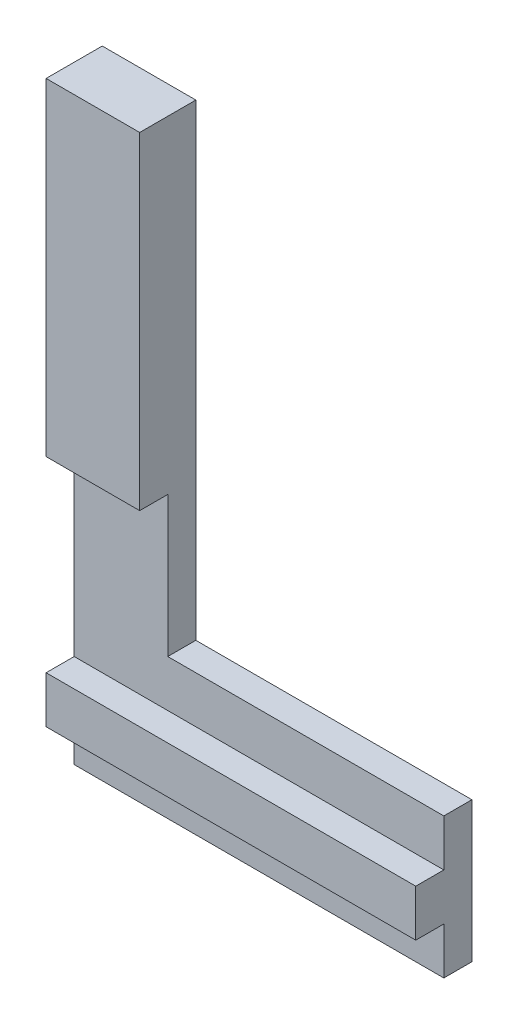
ISO-10303-21;
HEADER;
FILE_DESCRIPTION(('STEP AP214'),'2;1');
FILE_NAME('part.step','',(''),(''),'','','');
FILE_SCHEMA(('AUTOMOTIVE_DESIGN { 1 0 10303 214 1 1 1 1 }'));
ENDSEC;
DATA;
#1=APPLICATION_CONTEXT('core data for automotive mechanical design processes');
#2=APPLICATION_PROTOCOL_DEFINITION('international standard','automotive_design',2000,#1);
#3=PRODUCT_CONTEXT('',#1,'mechanical');
#4=PRODUCT('Part','Part','',(#3));
#5=PRODUCT_RELATED_PRODUCT_CATEGORY('part','',(#4));
#6=PRODUCT_DEFINITION_FORMATION('','',#4);
#7=PRODUCT_DEFINITION_CONTEXT('part definition',#1,'design');
#8=PRODUCT_DEFINITION('design','',#6,#7);
#9=PRODUCT_DEFINITION_SHAPE('','',#8);
#10=(LENGTH_UNIT() NAMED_UNIT(*) SI_UNIT(.MILLI.,.METRE.));
#11=(NAMED_UNIT(*) PLANE_ANGLE_UNIT() SI_UNIT($,.RADIAN.));
#12=(NAMED_UNIT(*) SI_UNIT($,.STERADIAN.) SOLID_ANGLE_UNIT());
#13=UNCERTAINTY_MEASURE_WITH_UNIT(LENGTH_MEASURE(1.E-05),#10,'distance_accuracy_value','');
#14=(GEOMETRIC_REPRESENTATION_CONTEXT(3) GLOBAL_UNCERTAINTY_ASSIGNED_CONTEXT((#13)) GLOBAL_UNIT_ASSIGNED_CONTEXT((#10,
#11,#12)) REPRESENTATION_CONTEXT('',''));
#15=CARTESIAN_POINT('',(0.,0.,0.));
#16=DIRECTION('',(0.,0.,1.));
#17=DIRECTION('',(1.,0.,0.));
#18=AXIS2_PLACEMENT_3D('',#15,#16,#17);
#19=CARTESIAN_POINT('',(0.,0.,6.));
#20=DIRECTION('',(0.,0.,1.));
#21=DIRECTION('',(1.,0.,0.));
#22=AXIS2_PLACEMENT_3D('',#19,#20,#21);
#23=PLANE('',#22);
#24=DIRECTION('',(0.,-1.,0.));
#25=VECTOR('',#24,1.);
#26=CARTESIAN_POINT('',(20.,0.,6.));
#27=LINE('',#26,#25);
#28=CARTESIAN_POINT('',(20.,30.,6.));
#29=VERTEX_POINT('',#28);
#30=CARTESIAN_POINT('',(20.,0.,6.));
#31=VERTEX_POINT('',#30);
#32=EDGE_CURVE('E199',#29,#31,#27,.T.);
#33=ORIENTED_EDGE('',*,*,#32,.F.);
#34=DIRECTION('',(1.,0.,0.));
#35=VECTOR('',#34,1.);
#36=CARTESIAN_POINT('',(0.,30.,6.));
#37=LINE('',#36,#35);
#38=CARTESIAN_POINT('',(0.,30.,6.));
#39=VERTEX_POINT('',#38);
#40=EDGE_CURVE('E141',#39,#29,#37,.T.);
#41=ORIENTED_EDGE('',*,*,#40,.F.);
#42=DIRECTION('',(0.,1.,0.));
#43=VECTOR('',#42,1.);
#44=CARTESIAN_POINT('',(0.,0.,6.));
#45=LINE('',#44,#43);
#46=CARTESIAN_POINT('',(0.,-10.,6.));
#47=VERTEX_POINT('',#46);
#48=EDGE_CURVE('E56',#47,#39,#45,.T.);
#49=ORIENTED_EDGE('',*,*,#48,.F.);
#50=DIRECTION('',(-1.,0.,0.));
#51=VECTOR('',#50,1.);
#52=CARTESIAN_POINT('',(0.,-10.,6.));
#53=LINE('',#52,#51);
#54=CARTESIAN_POINT('',(79.,-10.,6.));
#55=VERTEX_POINT('',#54);
#56=EDGE_CURVE('E51',#55,#47,#53,.T.);
#57=ORIENTED_EDGE('',*,*,#56,.F.);
#58=DIRECTION('',(0.,1.,0.));
#59=VECTOR('',#58,1.);
#60=CARTESIAN_POINT('',(79.,0.,6.));
#61=LINE('',#60,#59);
#62=CARTESIAN_POINT('',(79.,0.,6.));
#63=VERTEX_POINT('',#62);
#64=EDGE_CURVE('E177',#55,#63,#61,.T.);
#65=ORIENTED_EDGE('',*,*,#64,.T.);
#66=DIRECTION('',(-1.,0.,0.));
#67=VECTOR('',#66,1.);
#68=CARTESIAN_POINT('',(0.,0.,6.));
#69=LINE('',#68,#67);
#70=EDGE_CURVE('E181',#63,#31,#69,.T.);
#71=ORIENTED_EDGE('',*,*,#70,.T.);
#72=EDGE_LOOP('',(#33,#41,#49,#57,#65,#71));
#73=FACE_BOUND('',#72,.T.);
#74=ADVANCED_FACE('F36',(#73),#23,.T.);
#75=CARTESIAN_POINT('',(20.,0.,6.));
#76=DIRECTION('',(1.,0.,0.));
#77=DIRECTION('',(0.,1.,0.));
#78=AXIS2_PLACEMENT_3D('',#75,#76,#77);
#79=PLANE('',#78);
#80=DIRECTION('',(0.,-1.,0.));
#81=VECTOR('',#80,1.);
#82=CARTESIAN_POINT('',(20.,0.,0.));
#83=LINE('',#82,#81);
#84=CARTESIAN_POINT('',(20.,100.,0.));
#85=VERTEX_POINT('',#84);
#86=CARTESIAN_POINT('',(20.,0.,0.));
#87=VERTEX_POINT('',#86);
#88=EDGE_CURVE('E198',#85,#87,#83,.T.);
#89=ORIENTED_EDGE('',*,*,#88,.F.);
#90=DIRECTION('',(0.,0.,-1.));
#91=VECTOR('',#90,1.);
#92=CARTESIAN_POINT('',(20.,100.,6.));
#93=LINE('',#92,#91);
#94=CARTESIAN_POINT('',(20.,100.,12.));
#95=VERTEX_POINT('',#94);
#96=EDGE_CURVE('E11',#95,#85,#93,.T.);
#97=ORIENTED_EDGE('',*,*,#96,.F.);
#98=DIRECTION('',(0.,1.,0.));
#99=VECTOR('',#98,1.);
#100=CARTESIAN_POINT('',(20.,0.,12.));
#101=LINE('',#100,#99);
#102=CARTESIAN_POINT('',(20.,30.,12.));
#103=VERTEX_POINT('',#102);
#104=EDGE_CURVE('E132',#103,#95,#101,.T.);
#105=ORIENTED_EDGE('',*,*,#104,.F.);
#106=DIRECTION('',(0.,0.,-1.));
#107=VECTOR('',#106,1.);
#108=CARTESIAN_POINT('',(20.,30.,12.));
#109=LINE('',#108,#107);
#110=EDGE_CURVE('E128',#103,#29,#109,.T.);
#111=ORIENTED_EDGE('',*,*,#110,.T.);
#112=ORIENTED_EDGE('',*,*,#32,.T.);
#113=DIRECTION('',(0.,0.,-1.));
#114=VECTOR('',#113,1.);
#115=CARTESIAN_POINT('',(20.,0.,6.));
#116=LINE('',#115,#114);
#117=EDGE_CURVE('E205',#31,#87,#116,.T.);
#118=ORIENTED_EDGE('',*,*,#117,.T.);
#119=EDGE_LOOP('',(#89,#97,#105,#111,#112,#118));
#120=FACE_BOUND('',#119,.T.);
#121=ADVANCED_FACE('F38',(#120),#79,.T.);
#122=CARTESIAN_POINT('',(0.,100.,6.));
#123=DIRECTION('',(0.,1.,0.));
#124=DIRECTION('',(0.,0.,1.));
#125=AXIS2_PLACEMENT_3D('',#122,#123,#124);
#126=PLANE('',#125);
#127=DIRECTION('',(1.,0.,0.));
#128=VECTOR('',#127,1.);
#129=CARTESIAN_POINT('',(0.,100.,0.));
#130=LINE('',#129,#128);
#131=CARTESIAN_POINT('',(0.,100.,0.));
#132=VERTEX_POINT('',#131);
#133=EDGE_CURVE('E208',#132,#85,#130,.T.);
#134=ORIENTED_EDGE('',*,*,#133,.F.);
#135=DIRECTION('',(0.,0.,-1.));
#136=VECTOR('',#135,1.);
#137=CARTESIAN_POINT('',(0.,100.,6.));
#138=LINE('',#137,#136);
#139=CARTESIAN_POINT('',(0.,100.,12.));
#140=VERTEX_POINT('',#139);
#141=EDGE_CURVE('E44',#140,#132,#138,.T.);
#142=ORIENTED_EDGE('',*,*,#141,.F.);
#143=DIRECTION('',(-1.,0.,0.));
#144=VECTOR('',#143,1.);
#145=CARTESIAN_POINT('',(0.,100.,12.));
#146=LINE('',#145,#144);
#147=EDGE_CURVE('E139',#95,#140,#146,.T.);
#148=ORIENTED_EDGE('',*,*,#147,.F.);
#149=ORIENTED_EDGE('',*,*,#96,.T.);
#150=EDGE_LOOP('',(#134,#142,#148,#149));
#151=FACE_BOUND('',#150,.T.);
#152=ADVANCED_FACE('F217',(#151),#126,.T.);
#153=CARTESIAN_POINT('',(0.,0.,6.));
#154=DIRECTION('',(-1.,0.,0.));
#155=DIRECTION('',(0.,0.,1.));
#156=AXIS2_PLACEMENT_3D('',#153,#154,#155);
#157=PLANE('',#156);
#158=DIRECTION('',(0.,1.,0.));
#159=VECTOR('',#158,1.);
#160=CARTESIAN_POINT('',(0.,0.,0.));
#161=LINE('',#160,#159);
#162=CARTESIAN_POINT('',(0.,-30.,0.));
#163=VERTEX_POINT('',#162);
#164=EDGE_CURVE('E201',#163,#132,#161,.T.);
#165=ORIENTED_EDGE('',*,*,#164,.F.);
#166=DIRECTION('',(0.,0.,-1.));
#167=VECTOR('',#166,1.);
#168=CARTESIAN_POINT('',(0.,-30.,6.));
#169=LINE('',#168,#167);
#170=CARTESIAN_POINT('',(0.,-30.,6.));
#171=VERTEX_POINT('',#170);
#172=EDGE_CURVE('E184',#171,#163,#169,.T.);
#173=ORIENTED_EDGE('',*,*,#172,.F.);
#174=CARTESIAN_POINT('',(0.,-20.,6.));
#175=VERTEX_POINT('',#174);
#176=EDGE_CURVE('E202',#171,#175,#45,.T.);
#177=ORIENTED_EDGE('',*,*,#176,.T.);
#178=DIRECTION('',(0.,0.,-1.));
#179=VECTOR('',#178,1.);
#180=CARTESIAN_POINT('',(0.,-20.,12.));
#181=LINE('',#180,#179);
#182=CARTESIAN_POINT('',(0.,-20.,12.));
#183=VERTEX_POINT('',#182);
#184=EDGE_CURVE('E170',#183,#175,#181,.T.);
#185=ORIENTED_EDGE('',*,*,#184,.F.);
#186=DIRECTION('',(0.,-1.,0.));
#187=VECTOR('',#186,1.);
#188=CARTESIAN_POINT('',(0.,-10.,12.));
#189=LINE('',#188,#187);
#190=CARTESIAN_POINT('',(0.,-10.,12.));
#191=VERTEX_POINT('',#190);
#192=EDGE_CURVE('E152',#191,#183,#189,.T.);
#193=ORIENTED_EDGE('',*,*,#192,.F.);
#194=DIRECTION('',(0.,0.,-1.));
#195=VECTOR('',#194,1.);
#196=CARTESIAN_POINT('',(0.,-10.,12.));
#197=LINE('',#196,#195);
#198=EDGE_CURVE('E160',#191,#47,#197,.T.);
#199=ORIENTED_EDGE('',*,*,#198,.T.);
#200=ORIENTED_EDGE('',*,*,#48,.T.);
#201=DIRECTION('',(0.,0.,-1.));
#202=VECTOR('',#201,1.);
#203=CARTESIAN_POINT('',(0.,30.,12.));
#204=LINE('',#203,#202);
#205=CARTESIAN_POINT('',(0.,30.,12.));
#206=VERTEX_POINT('',#205);
#207=EDGE_CURVE('E126',#206,#39,#204,.T.);
#208=ORIENTED_EDGE('',*,*,#207,.F.);
#209=DIRECTION('',(0.,-1.,0.));
#210=VECTOR('',#209,1.);
#211=CARTESIAN_POINT('',(0.,0.,12.));
#212=LINE('',#211,#210);
#213=EDGE_CURVE('E133',#140,#206,#212,.T.);
#214=ORIENTED_EDGE('',*,*,#213,.F.);
#215=ORIENTED_EDGE('',*,*,#141,.T.);
#216=EDGE_LOOP('',(#165,#173,#177,#185,#193,#199,#200,#208,#214,#215));
#217=FACE_BOUND('',#216,.T.);
#218=ADVANCED_FACE('F143',(#217),#157,.T.);
#219=DIRECTION('',(1.,0.,0.));
#220=VECTOR('',#219,1.);
#221=CARTESIAN_POINT('',(0.,-20.,6.));
#222=LINE('',#221,#220);
#223=CARTESIAN_POINT('',(79.,-20.,6.));
#224=VERTEX_POINT('',#223);
#225=EDGE_CURVE('E145',#175,#224,#222,.T.);
#226=ORIENTED_EDGE('',*,*,#225,.F.);
#227=ORIENTED_EDGE('',*,*,#176,.F.);
#228=DIRECTION('',(1.,0.,0.));
#229=VECTOR('',#228,1.);
#230=CARTESIAN_POINT('',(0.,-30.,6.));
#231=LINE('',#230,#229);
#232=CARTESIAN_POINT('',(79.,-30.,6.));
#233=VERTEX_POINT('',#232);
#234=EDGE_CURVE('E174',#171,#233,#231,.T.);
#235=ORIENTED_EDGE('',*,*,#234,.T.);
#236=EDGE_CURVE('E179',#233,#224,#61,.T.);
#237=ORIENTED_EDGE('',*,*,#236,.T.);
#238=EDGE_LOOP('',(#226,#227,#235,#237));
#239=FACE_BOUND('',#238,.T.);
#240=ADVANCED_FACE('F258',(#239),#23,.T.);
#241=CARTESIAN_POINT('',(0.,0.,0.));
#242=DIRECTION('',(0.,0.,1.));
#243=DIRECTION('',(1.,0.,0.));
#244=AXIS2_PLACEMENT_3D('',#241,#242,#243);
#245=PLANE('',#244);
#246=ORIENTED_EDGE('',*,*,#88,.T.);
#247=DIRECTION('',(-1.,0.,0.));
#248=VECTOR('',#247,1.);
#249=CARTESIAN_POINT('',(0.,0.,0.));
#250=LINE('',#249,#248);
#251=CARTESIAN_POINT('',(79.,0.,0.));
#252=VERTEX_POINT('',#251);
#253=EDGE_CURVE('E178',#252,#87,#250,.T.);
#254=ORIENTED_EDGE('',*,*,#253,.F.);
#255=DIRECTION('',(0.,1.,0.));
#256=VECTOR('',#255,1.);
#257=CARTESIAN_POINT('',(79.,0.,0.));
#258=LINE('',#257,#256);
#259=CARTESIAN_POINT('',(79.,-30.,0.));
#260=VERTEX_POINT('',#259);
#261=EDGE_CURVE('E187',#260,#252,#258,.T.);
#262=ORIENTED_EDGE('',*,*,#261,.F.);
#263=DIRECTION('',(1.,0.,0.));
#264=VECTOR('',#263,1.);
#265=CARTESIAN_POINT('',(0.,-30.,0.));
#266=LINE('',#265,#264);
#267=EDGE_CURVE('E173',#163,#260,#266,.T.);
#268=ORIENTED_EDGE('',*,*,#267,.F.);
#269=ORIENTED_EDGE('',*,*,#164,.T.);
#270=ORIENTED_EDGE('',*,*,#133,.T.);
#271=EDGE_LOOP('',(#246,#254,#262,#268,#269,#270));
#272=FACE_BOUND('',#271,.T.);
#273=ADVANCED_FACE('F221',(#272),#245,.F.);
#274=CARTESIAN_POINT('',(0.,-30.,6.));
#275=DIRECTION('',(0.,1.,0.));
#276=DIRECTION('',(0.,0.,1.));
#277=AXIS2_PLACEMENT_3D('',#274,#275,#276);
#278=PLANE('',#277);
#279=ORIENTED_EDGE('',*,*,#267,.T.);
#280=DIRECTION('',(0.,0.,-1.));
#281=VECTOR('',#280,1.);
#282=CARTESIAN_POINT('',(79.,-30.,6.));
#283=LINE('',#282,#281);
#284=EDGE_CURVE('E195',#233,#260,#283,.T.);
#285=ORIENTED_EDGE('',*,*,#284,.F.);
#286=ORIENTED_EDGE('',*,*,#234,.F.);
#287=ORIENTED_EDGE('',*,*,#172,.T.);
#288=EDGE_LOOP('',(#279,#285,#286,#287));
#289=FACE_BOUND('',#288,.T.);
#290=ADVANCED_FACE('F225',(#289),#278,.F.);
#291=CARTESIAN_POINT('',(79.,0.,6.));
#292=DIRECTION('',(-1.,0.,0.));
#293=DIRECTION('',(0.,0.,1.));
#294=AXIS2_PLACEMENT_3D('',#291,#292,#293);
#295=PLANE('',#294);
#296=ORIENTED_EDGE('',*,*,#261,.T.);
#297=DIRECTION('',(0.,0.,-1.));
#298=VECTOR('',#297,1.);
#299=CARTESIAN_POINT('',(79.,0.,6.));
#300=LINE('',#299,#298);
#301=EDGE_CURVE('E192',#63,#252,#300,.T.);
#302=ORIENTED_EDGE('',*,*,#301,.F.);
#303=ORIENTED_EDGE('',*,*,#64,.F.);
#304=DIRECTION('',(0.,0.,-1.));
#305=VECTOR('',#304,1.);
#306=CARTESIAN_POINT('',(79.,-10.,12.));
#307=LINE('',#306,#305);
#308=CARTESIAN_POINT('',(79.,-10.,12.));
#309=VERTEX_POINT('',#308);
#310=EDGE_CURVE('E164',#309,#55,#307,.T.);
#311=ORIENTED_EDGE('',*,*,#310,.F.);
#312=DIRECTION('',(0.,1.,0.));
#313=VECTOR('',#312,1.);
#314=CARTESIAN_POINT('',(79.,-10.,12.));
#315=LINE('',#314,#313);
#316=CARTESIAN_POINT('',(79.,-20.,12.));
#317=VERTEX_POINT('',#316);
#318=EDGE_CURVE('E157',#317,#309,#315,.T.);
#319=ORIENTED_EDGE('',*,*,#318,.F.);
#320=DIRECTION('',(0.,0.,-1.));
#321=VECTOR('',#320,1.);
#322=CARTESIAN_POINT('',(79.,-20.,12.));
#323=LINE('',#322,#321);
#324=EDGE_CURVE('E167',#317,#224,#323,.T.);
#325=ORIENTED_EDGE('',*,*,#324,.T.);
#326=ORIENTED_EDGE('',*,*,#236,.F.);
#327=ORIENTED_EDGE('',*,*,#284,.T.);
#328=EDGE_LOOP('',(#296,#302,#303,#311,#319,#325,#326,#327));
#329=FACE_BOUND('',#328,.T.);
#330=ADVANCED_FACE('F242',(#329),#295,.F.);
#331=CARTESIAN_POINT('',(0.,0.,6.));
#332=DIRECTION('',(0.,-1.,0.));
#333=DIRECTION('',(1.,0.,0.));
#334=AXIS2_PLACEMENT_3D('',#331,#332,#333);
#335=PLANE('',#334);
#336=ORIENTED_EDGE('',*,*,#117,.F.);
#337=ORIENTED_EDGE('',*,*,#70,.F.);
#338=ORIENTED_EDGE('',*,*,#301,.T.);
#339=ORIENTED_EDGE('',*,*,#253,.T.);
#340=EDGE_LOOP('',(#336,#337,#338,#339));
#341=FACE_BOUND('',#340,.T.);
#342=ADVANCED_FACE('F248',(#341),#335,.F.);
#343=CARTESIAN_POINT('',(0.,-20.,12.));
#344=DIRECTION('',(0.,1.,0.));
#345=DIRECTION('',(0.,0.,1.));
#346=AXIS2_PLACEMENT_3D('',#343,#344,#345);
#347=PLANE('',#346);
#348=ORIENTED_EDGE('',*,*,#225,.T.);
#349=ORIENTED_EDGE('',*,*,#324,.F.);
#350=DIRECTION('',(1.,0.,0.));
#351=VECTOR('',#350,1.);
#352=CARTESIAN_POINT('',(0.,-20.,12.));
#353=LINE('',#352,#351);
#354=EDGE_CURVE('E155',#183,#317,#353,.T.);
#355=ORIENTED_EDGE('',*,*,#354,.F.);
#356=ORIENTED_EDGE('',*,*,#184,.T.);
#357=EDGE_LOOP('',(#348,#349,#355,#356));
#358=FACE_BOUND('',#357,.T.);
#359=ADVANCED_FACE('F231',(#358),#347,.F.);
#360=CARTESIAN_POINT('',(0.,-10.,12.));
#361=DIRECTION('',(0.,-1.,0.));
#362=DIRECTION('',(0.,0.,-1.));
#363=AXIS2_PLACEMENT_3D('',#360,#361,#362);
#364=PLANE('',#363);
#365=ORIENTED_EDGE('',*,*,#56,.T.);
#366=ORIENTED_EDGE('',*,*,#198,.F.);
#367=DIRECTION('',(-1.,0.,0.));
#368=VECTOR('',#367,1.);
#369=CARTESIAN_POINT('',(0.,-10.,12.));
#370=LINE('',#369,#368);
#371=EDGE_CURVE('E159',#309,#191,#370,.T.);
#372=ORIENTED_EDGE('',*,*,#371,.F.);
#373=ORIENTED_EDGE('',*,*,#310,.T.);
#374=EDGE_LOOP('',(#365,#366,#372,#373));
#375=FACE_BOUND('',#374,.T.);
#376=ADVANCED_FACE('F239',(#375),#364,.F.);
#377=CARTESIAN_POINT('',(0.,0.,12.));
#378=DIRECTION('',(0.,0.,1.));
#379=DIRECTION('',(1.,0.,0.));
#380=AXIS2_PLACEMENT_3D('',#377,#378,#379);
#381=PLANE('',#380);
#382=ORIENTED_EDGE('',*,*,#192,.T.);
#383=ORIENTED_EDGE('',*,*,#354,.T.);
#384=ORIENTED_EDGE('',*,*,#318,.T.);
#385=ORIENTED_EDGE('',*,*,#371,.T.);
#386=EDGE_LOOP('',(#382,#383,#384,#385));
#387=FACE_BOUND('',#386,.T.);
#388=ADVANCED_FACE('F235',(#387),#381,.T.);
#389=CARTESIAN_POINT('',(0.,30.,12.));
#390=DIRECTION('',(0.,1.,0.));
#391=DIRECTION('',(0.,0.,1.));
#392=AXIS2_PLACEMENT_3D('',#389,#390,#391);
#393=PLANE('',#392);
#394=ORIENTED_EDGE('',*,*,#40,.T.);
#395=ORIENTED_EDGE('',*,*,#110,.F.);
#396=DIRECTION('',(1.,0.,0.));
#397=VECTOR('',#396,1.);
#398=CARTESIAN_POINT('',(0.,30.,12.));
#399=LINE('',#398,#397);
#400=EDGE_CURVE('E122',#206,#103,#399,.T.);
#401=ORIENTED_EDGE('',*,*,#400,.F.);
#402=ORIENTED_EDGE('',*,*,#207,.T.);
#403=EDGE_LOOP('',(#394,#395,#401,#402));
#404=FACE_BOUND('',#403,.T.);
#405=ADVANCED_FACE('F124',(#404),#393,.F.);
#406=CARTESIAN_POINT('',(0.,0.,12.));
#407=DIRECTION('',(0.,0.,1.));
#408=DIRECTION('',(1.,0.,0.));
#409=AXIS2_PLACEMENT_3D('',#406,#407,#408);
#410=PLANE('',#409);
#411=ORIENTED_EDGE('',*,*,#213,.T.);
#412=ORIENTED_EDGE('',*,*,#400,.T.);
#413=ORIENTED_EDGE('',*,*,#104,.T.);
#414=ORIENTED_EDGE('',*,*,#147,.T.);
#415=EDGE_LOOP('',(#411,#412,#413,#414));
#416=FACE_BOUND('',#415,.T.);
#417=ADVANCED_FACE('F137',(#416),#410,.T.);
#418=CLOSED_SHELL('',(#74,#121,#152,#218,#240,#273,#290,#330,#342,#359,#376,#388,#405,#417));
#419=MANIFOLD_SOLID_BREP('B2',#418);
#420=ADVANCED_BREP_SHAPE_REPRESENTATION('',(#18,#419),#14);
#421=SHAPE_DEFINITION_REPRESENTATION(#9,#420);
ENDSEC;
END-ISO-10303-21;
